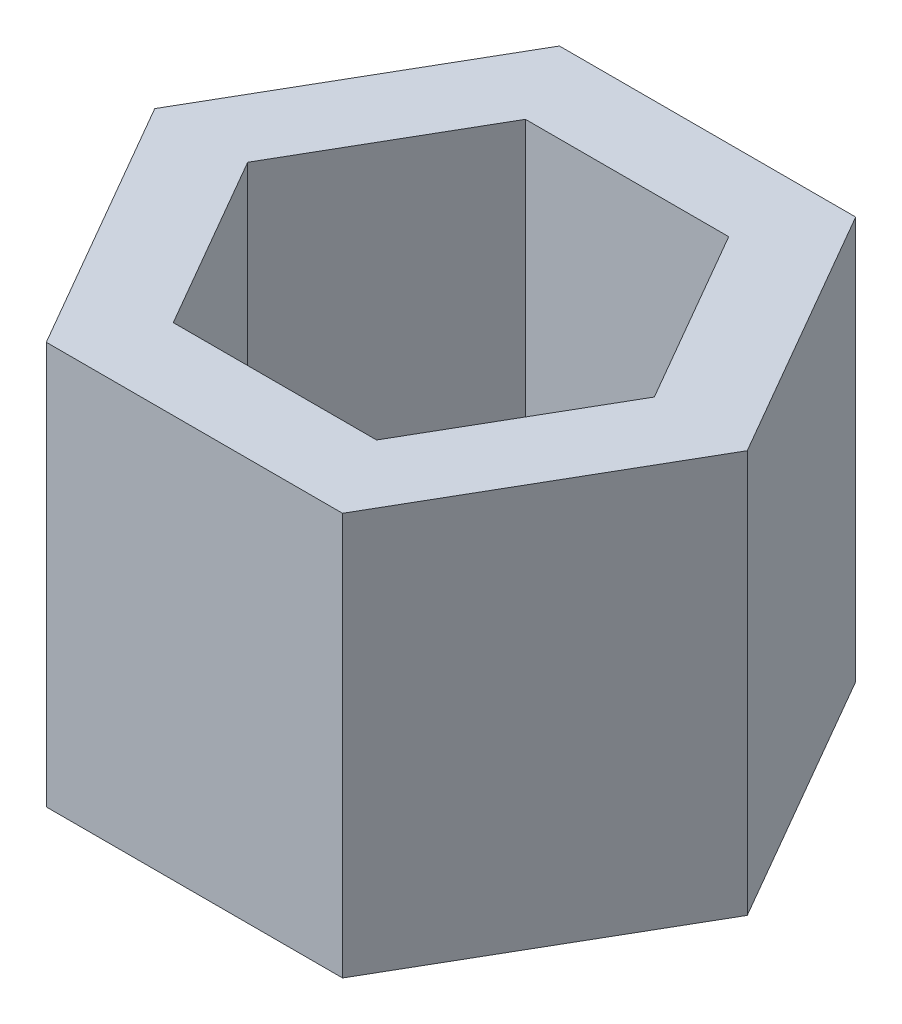
ISO-10303-21;
HEADER;
FILE_DESCRIPTION(('STEP AP214'),'2;1');
FILE_NAME('part.step','',(''),(''),'','','');
FILE_SCHEMA(('AUTOMOTIVE_DESIGN { 1 0 10303 214 1 1 1 1 }'));
ENDSEC;
DATA;
#1=APPLICATION_CONTEXT('core data for automotive mechanical design processes');
#2=APPLICATION_PROTOCOL_DEFINITION('international standard','automotive_design',2000,#1);
#3=PRODUCT_CONTEXT('',#1,'mechanical');
#4=PRODUCT('Part','Part','',(#3));
#5=PRODUCT_RELATED_PRODUCT_CATEGORY('part','',(#4));
#6=PRODUCT_DEFINITION_FORMATION('','',#4);
#7=PRODUCT_DEFINITION_CONTEXT('part definition',#1,'design');
#8=PRODUCT_DEFINITION('design','',#6,#7);
#9=PRODUCT_DEFINITION_SHAPE('','',#8);
#10=(LENGTH_UNIT() NAMED_UNIT(*) SI_UNIT(.MILLI.,.METRE.));
#11=(NAMED_UNIT(*) PLANE_ANGLE_UNIT() SI_UNIT($,.RADIAN.));
#12=(NAMED_UNIT(*) SI_UNIT($,.STERADIAN.) SOLID_ANGLE_UNIT());
#13=UNCERTAINTY_MEASURE_WITH_UNIT(LENGTH_MEASURE(1.E-05),#10,'distance_accuracy_value','');
#14=(GEOMETRIC_REPRESENTATION_CONTEXT(3) GLOBAL_UNCERTAINTY_ASSIGNED_CONTEXT((#13)) GLOBAL_UNIT_ASSIGNED_CONTEXT((#10,
#11,#12)) REPRESENTATION_CONTEXT('',''));
#15=CARTESIAN_POINT('',(0.,0.,0.));
#16=DIRECTION('',(0.,0.,1.));
#17=DIRECTION('',(1.,0.,0.));
#18=AXIS2_PLACEMENT_3D('',#15,#16,#17);
#19=CARTESIAN_POINT('',(0.,10.,0.));
#20=DIRECTION('',(0.,1.,0.));
#21=DIRECTION('',(0.,0.,1.));
#22=AXIS2_PLACEMENT_3D('',#19,#20,#21);
#23=PLANE('',#22);
#24=DIRECTION('',(0.5,0.,-0.866025403784439));
#25=VECTOR('',#24,1.);
#26=CARTESIAN_POINT('',(3.68060796608389,10.,6.37499999999998));
#27=LINE('',#26,#25);
#28=CARTESIAN_POINT('',(3.68060796608389,10.,6.37499999999998));
#29=VERTEX_POINT('',#28);
#30=CARTESIAN_POINT('',(7.36121593216773,10.,0.));
#31=VERTEX_POINT('',#30);
#32=EDGE_CURVE('E173',#29,#31,#27,.T.);
#33=ORIENTED_EDGE('',*,*,#32,.T.);
#34=DIRECTION('',(-0.5,0.,-0.866025403784439));
#35=VECTOR('',#34,1.);
#36=CARTESIAN_POINT('',(7.36121593216773,10.,0.));
#37=LINE('',#36,#35);
#38=CARTESIAN_POINT('',(3.68060796608385,10.,-6.37500000000001));
#39=VERTEX_POINT('',#38);
#40=EDGE_CURVE('E176',#31,#39,#37,.T.);
#41=ORIENTED_EDGE('',*,*,#40,.T.);
#42=DIRECTION('',(-1.,0.,0.));
#43=VECTOR('',#42,1.);
#44=CARTESIAN_POINT('',(3.68060796608385,10.,-6.37500000000001));
#45=LINE('',#44,#43);
#46=CARTESIAN_POINT('',(-3.68060796608387,10.,-6.37500000000001));
#47=VERTEX_POINT('',#46);
#48=EDGE_CURVE('E179',#39,#47,#45,.T.);
#49=ORIENTED_EDGE('',*,*,#48,.T.);
#50=DIRECTION('',(-0.5,0.,0.866025403784439));
#51=VECTOR('',#50,1.);
#52=CARTESIAN_POINT('',(-3.68060796608387,10.,-6.37500000000001));
#53=LINE('',#52,#51);
#54=CARTESIAN_POINT('',(-7.36121593216774,10.,0.));
#55=VERTEX_POINT('',#54);
#56=EDGE_CURVE('E181',#47,#55,#53,.T.);
#57=ORIENTED_EDGE('',*,*,#56,.T.);
#58=DIRECTION('',(0.5,0.,0.866025403784439));
#59=VECTOR('',#58,1.);
#60=CARTESIAN_POINT('',(-7.36121593216774,10.,0.));
#61=LINE('',#60,#59);
#62=CARTESIAN_POINT('',(-3.68060796608387,10.,6.37499999999999));
#63=VERTEX_POINT('',#62);
#64=EDGE_CURVE('E183',#55,#63,#61,.T.);
#65=ORIENTED_EDGE('',*,*,#64,.T.);
#66=DIRECTION('',(1.,0.,0.));
#67=VECTOR('',#66,1.);
#68=CARTESIAN_POINT('',(-3.68060796608387,10.,6.37499999999999));
#69=LINE('',#68,#67);
#70=EDGE_CURVE('E185',#63,#29,#69,.T.);
#71=ORIENTED_EDGE('',*,*,#70,.T.);
#72=EDGE_LOOP('',(#33,#41,#49,#57,#65,#71));
#73=FACE_BOUND('',#72,.T.);
#74=DIRECTION('',(-1.,0.,0.));
#75=VECTOR('',#74,1.);
#76=CARTESIAN_POINT('',(2.52590742770459,10.,-4.375));
#77=LINE('',#76,#75);
#78=CARTESIAN_POINT('',(2.52590742770459,10.,-4.375));
#79=VERTEX_POINT('',#78);
#80=CARTESIAN_POINT('',(-2.52590742770461,10.,-4.375));
#81=VERTEX_POINT('',#80);
#82=EDGE_CURVE('E130',#79,#81,#77,.T.);
#83=ORIENTED_EDGE('',*,*,#82,.F.);
#84=DIRECTION('',(-0.500000000000001,0.,-0.866025403784438));
#85=VECTOR('',#84,1.);
#86=CARTESIAN_POINT('',(5.05181485540919,10.,0.));
#87=LINE('',#86,#85);
#88=CARTESIAN_POINT('',(5.05181485540919,10.,0.));
#89=VERTEX_POINT('',#88);
#90=EDGE_CURVE('E122',#89,#79,#87,.T.);
#91=ORIENTED_EDGE('',*,*,#90,.F.);
#92=DIRECTION('',(0.499999999999999,0.,-0.866025403784439));
#93=VECTOR('',#92,1.);
#94=CARTESIAN_POINT('',(2.52590742770457,10.,4.375));
#95=LINE('',#94,#93);
#96=CARTESIAN_POINT('',(2.52590742770457,10.,4.375));
#97=VERTEX_POINT('',#96);
#98=EDGE_CURVE('E151',#97,#89,#95,.T.);
#99=ORIENTED_EDGE('',*,*,#98,.F.);
#100=DIRECTION('',(1.,0.,0.));
#101=VECTOR('',#100,1.);
#102=CARTESIAN_POINT('',(-2.52590742770461,10.,4.375));
#103=LINE('',#102,#101);
#104=CARTESIAN_POINT('',(-2.52590742770461,10.,4.375));
#105=VERTEX_POINT('',#104);
#106=EDGE_CURVE('E149',#105,#97,#103,.T.);
#107=ORIENTED_EDGE('',*,*,#106,.F.);
#108=DIRECTION('',(0.5,0.,0.866025403784439));
#109=VECTOR('',#108,1.);
#110=CARTESIAN_POINT('',(-5.05181485540922,10.,0.));
#111=LINE('',#110,#109);
#112=CARTESIAN_POINT('',(-5.05181485540922,10.,0.));
#113=VERTEX_POINT('',#112);
#114=EDGE_CURVE('E145',#113,#105,#111,.T.);
#115=ORIENTED_EDGE('',*,*,#114,.F.);
#116=DIRECTION('',(-0.499999999999999,0.,0.866025403784439));
#117=VECTOR('',#116,1.);
#118=CARTESIAN_POINT('',(-2.52590742770461,10.,-4.375));
#119=LINE('',#118,#117);
#120=EDGE_CURVE('E143',#81,#113,#119,.T.);
#121=ORIENTED_EDGE('',*,*,#120,.F.);
#122=EDGE_LOOP('',(#83,#91,#99,#107,#115,#121));
#123=FACE_BOUND('',#122,.T.);
#124=ADVANCED_FACE('F33',(#73,#123),#23,.T.);
#125=CARTESIAN_POINT('',(0.,0.,0.));
#126=DIRECTION('',(0.,1.,0.));
#127=DIRECTION('',(0.,0.,1.));
#128=AXIS2_PLACEMENT_3D('',#125,#126,#127);
#129=PLANE('',#128);
#130=DIRECTION('',(0.5,0.,-0.866025403784439));
#131=VECTOR('',#130,1.);
#132=CARTESIAN_POINT('',(3.68060796608389,0.,6.37499999999998));
#133=LINE('',#132,#131);
#134=CARTESIAN_POINT('',(3.68060796608389,0.,6.37499999999998));
#135=VERTEX_POINT('',#134);
#136=CARTESIAN_POINT('',(7.36121593216773,0.,0.));
#137=VERTEX_POINT('',#136);
#138=EDGE_CURVE('E138',#135,#137,#133,.T.);
#139=ORIENTED_EDGE('',*,*,#138,.F.);
#140=DIRECTION('',(1.,0.,0.));
#141=VECTOR('',#140,1.);
#142=CARTESIAN_POINT('',(-3.68060796608387,0.,6.37499999999999));
#143=LINE('',#142,#141);
#144=CARTESIAN_POINT('',(-3.68060796608387,0.,6.37499999999999));
#145=VERTEX_POINT('',#144);
#146=EDGE_CURVE('E177',#145,#135,#143,.T.);
#147=ORIENTED_EDGE('',*,*,#146,.F.);
#148=DIRECTION('',(0.5,0.,0.866025403784439));
#149=VECTOR('',#148,1.);
#150=CARTESIAN_POINT('',(-7.36121593216774,0.,0.));
#151=LINE('',#150,#149);
#152=CARTESIAN_POINT('',(-7.36121593216774,0.,0.));
#153=VERTEX_POINT('',#152);
#154=EDGE_CURVE('E196',#153,#145,#151,.T.);
#155=ORIENTED_EDGE('',*,*,#154,.F.);
#156=DIRECTION('',(-0.5,0.,0.866025403784439));
#157=VECTOR('',#156,1.);
#158=CARTESIAN_POINT('',(-3.68060796608387,0.,-6.37500000000001));
#159=LINE('',#158,#157);
#160=CARTESIAN_POINT('',(-3.68060796608387,0.,-6.37500000000001));
#161=VERTEX_POINT('',#160);
#162=EDGE_CURVE('E194',#161,#153,#159,.T.);
#163=ORIENTED_EDGE('',*,*,#162,.F.);
#164=DIRECTION('',(-1.,0.,0.));
#165=VECTOR('',#164,1.);
#166=CARTESIAN_POINT('',(3.68060796608385,0.,-6.37500000000001));
#167=LINE('',#166,#165);
#168=CARTESIAN_POINT('',(3.68060796608385,0.,-6.37500000000001));
#169=VERTEX_POINT('',#168);
#170=EDGE_CURVE('E192',#169,#161,#167,.T.);
#171=ORIENTED_EDGE('',*,*,#170,.F.);
#172=DIRECTION('',(-0.5,0.,-0.866025403784439));
#173=VECTOR('',#172,1.);
#174=CARTESIAN_POINT('',(7.36121593216773,0.,0.));
#175=LINE('',#174,#173);
#176=EDGE_CURVE('E190',#137,#169,#175,.T.);
#177=ORIENTED_EDGE('',*,*,#176,.F.);
#178=EDGE_LOOP('',(#139,#147,#155,#163,#171,#177));
#179=FACE_BOUND('',#178,.T.);
#180=DIRECTION('',(-0.500000000000001,0.,-0.866025403784438));
#181=VECTOR('',#180,1.);
#182=CARTESIAN_POINT('',(5.05181485540919,0.,0.));
#183=LINE('',#182,#181);
#184=CARTESIAN_POINT('',(5.05181485540919,0.,0.));
#185=VERTEX_POINT('',#184);
#186=CARTESIAN_POINT('',(2.52590742770459,0.,-4.375));
#187=VERTEX_POINT('',#186);
#188=EDGE_CURVE('E56',#185,#187,#183,.T.);
#189=ORIENTED_EDGE('',*,*,#188,.T.);
#190=DIRECTION('',(-1.,0.,0.));
#191=VECTOR('',#190,1.);
#192=CARTESIAN_POINT('',(2.52590742770459,0.,-4.375));
#193=LINE('',#192,#191);
#194=CARTESIAN_POINT('',(-2.52590742770461,0.,-4.375));
#195=VERTEX_POINT('',#194);
#196=EDGE_CURVE('E137',#187,#195,#193,.T.);
#197=ORIENTED_EDGE('',*,*,#196,.T.);
#198=DIRECTION('',(-0.499999999999999,0.,0.866025403784439));
#199=VECTOR('',#198,1.);
#200=CARTESIAN_POINT('',(-2.52590742770461,0.,-4.375));
#201=LINE('',#200,#199);
#202=CARTESIAN_POINT('',(-5.05181485540922,0.,0.));
#203=VERTEX_POINT('',#202);
#204=EDGE_CURVE('E155',#195,#203,#201,.T.);
#205=ORIENTED_EDGE('',*,*,#204,.T.);
#206=DIRECTION('',(0.5,0.,0.866025403784439));
#207=VECTOR('',#206,1.);
#208=CARTESIAN_POINT('',(-5.05181485540922,0.,0.));
#209=LINE('',#208,#207);
#210=CARTESIAN_POINT('',(-2.52590742770461,0.,4.375));
#211=VERTEX_POINT('',#210);
#212=EDGE_CURVE('E158',#203,#211,#209,.T.);
#213=ORIENTED_EDGE('',*,*,#212,.T.);
#214=DIRECTION('',(1.,0.,0.));
#215=VECTOR('',#214,1.);
#216=CARTESIAN_POINT('',(-2.52590742770461,0.,4.375));
#217=LINE('',#216,#215);
#218=CARTESIAN_POINT('',(2.52590742770457,0.,4.375));
#219=VERTEX_POINT('',#218);
#220=EDGE_CURVE('E161',#211,#219,#217,.T.);
#221=ORIENTED_EDGE('',*,*,#220,.T.);
#222=DIRECTION('',(0.499999999999999,0.,-0.866025403784439));
#223=VECTOR('',#222,1.);
#224=CARTESIAN_POINT('',(2.52590742770457,0.,4.375));
#225=LINE('',#224,#223);
#226=EDGE_CURVE('E131',#219,#185,#225,.T.);
#227=ORIENTED_EDGE('',*,*,#226,.T.);
#228=EDGE_LOOP('',(#189,#197,#205,#213,#221,#227));
#229=FACE_BOUND('',#228,.T.);
#230=ADVANCED_FACE('F220',(#179,#229),#129,.F.);
#231=CARTESIAN_POINT('',(3.68060796608389,10.,6.37499999999998));
#232=DIRECTION('',(-0.866025403784439,0.,-0.5));
#233=DIRECTION('',(-0.5,0.,0.866025403784439));
#234=AXIS2_PLACEMENT_3D('',#231,#232,#233);
#235=PLANE('',#234);
#236=ORIENTED_EDGE('',*,*,#138,.T.);
#237=DIRECTION('',(0.,-1.,0.));
#238=VECTOR('',#237,1.);
#239=CARTESIAN_POINT('',(7.36121593216773,10.,0.));
#240=LINE('',#239,#238);
#241=EDGE_CURVE('E11',#31,#137,#240,.T.);
#242=ORIENTED_EDGE('',*,*,#241,.F.);
#243=ORIENTED_EDGE('',*,*,#32,.F.);
#244=DIRECTION('',(0.,-1.,0.));
#245=VECTOR('',#244,1.);
#246=CARTESIAN_POINT('',(3.68060796608389,10.,6.37499999999998));
#247=LINE('',#246,#245);
#248=EDGE_CURVE('E187',#29,#135,#247,.T.);
#249=ORIENTED_EDGE('',*,*,#248,.T.);
#250=EDGE_LOOP('',(#236,#242,#243,#249));
#251=FACE_BOUND('',#250,.T.);
#252=ADVANCED_FACE('F35',(#251),#235,.F.);
#253=CARTESIAN_POINT('',(7.36121593216773,10.,0.));
#254=DIRECTION('',(-0.866025403784439,0.,0.5));
#255=DIRECTION('',(0.5,0.,0.866025403784439));
#256=AXIS2_PLACEMENT_3D('',#253,#254,#255);
#257=PLANE('',#256);
#258=ORIENTED_EDGE('',*,*,#176,.T.);
#259=DIRECTION('',(0.,-1.,0.));
#260=VECTOR('',#259,1.);
#261=CARTESIAN_POINT('',(3.68060796608385,10.,-6.37500000000001));
#262=LINE('',#261,#260);
#263=EDGE_CURVE('E41',#39,#169,#262,.T.);
#264=ORIENTED_EDGE('',*,*,#263,.F.);
#265=ORIENTED_EDGE('',*,*,#40,.F.);
#266=ORIENTED_EDGE('',*,*,#241,.T.);
#267=EDGE_LOOP('',(#258,#264,#265,#266));
#268=FACE_BOUND('',#267,.T.);
#269=ADVANCED_FACE('F237',(#268),#257,.F.);
#270=CARTESIAN_POINT('',(3.68060796608385,10.,-6.37500000000001));
#271=DIRECTION('',(0.,0.,1.));
#272=DIRECTION('',(1.,0.,0.));
#273=AXIS2_PLACEMENT_3D('',#270,#271,#272);
#274=PLANE('',#273);
#275=ORIENTED_EDGE('',*,*,#170,.T.);
#276=DIRECTION('',(0.,-1.,0.));
#277=VECTOR('',#276,1.);
#278=CARTESIAN_POINT('',(-3.68060796608387,10.,-6.37500000000001));
#279=LINE('',#278,#277);
#280=EDGE_CURVE('E207',#47,#161,#279,.T.);
#281=ORIENTED_EDGE('',*,*,#280,.F.);
#282=ORIENTED_EDGE('',*,*,#48,.F.);
#283=ORIENTED_EDGE('',*,*,#263,.T.);
#284=EDGE_LOOP('',(#275,#281,#282,#283));
#285=FACE_BOUND('',#284,.T.);
#286=ADVANCED_FACE('F214',(#285),#274,.F.);
#287=CARTESIAN_POINT('',(-3.68060796608387,10.,-6.37500000000001));
#288=DIRECTION('',(0.866025403784439,0.,0.5));
#289=DIRECTION('',(0.5,0.,-0.866025403784439));
#290=AXIS2_PLACEMENT_3D('',#287,#288,#289);
#291=PLANE('',#290);
#292=ORIENTED_EDGE('',*,*,#162,.T.);
#293=DIRECTION('',(0.,-1.,0.));
#294=VECTOR('',#293,1.);
#295=CARTESIAN_POINT('',(-7.36121593216774,10.,0.));
#296=LINE('',#295,#294);
#297=EDGE_CURVE('E204',#55,#153,#296,.T.);
#298=ORIENTED_EDGE('',*,*,#297,.F.);
#299=ORIENTED_EDGE('',*,*,#56,.F.);
#300=ORIENTED_EDGE('',*,*,#280,.T.);
#301=EDGE_LOOP('',(#292,#298,#299,#300));
#302=FACE_BOUND('',#301,.T.);
#303=ADVANCED_FACE('F226',(#302),#291,.F.);
#304=CARTESIAN_POINT('',(-7.36121593216774,10.,0.));
#305=DIRECTION('',(0.866025403784439,0.,-0.5));
#306=DIRECTION('',(-0.5,0.,-0.866025403784439));
#307=AXIS2_PLACEMENT_3D('',#304,#305,#306);
#308=PLANE('',#307);
#309=ORIENTED_EDGE('',*,*,#154,.T.);
#310=DIRECTION('',(0.,-1.,0.));
#311=VECTOR('',#310,1.);
#312=CARTESIAN_POINT('',(-3.68060796608387,10.,6.37499999999999));
#313=LINE('',#312,#311);
#314=EDGE_CURVE('E201',#63,#145,#313,.T.);
#315=ORIENTED_EDGE('',*,*,#314,.F.);
#316=ORIENTED_EDGE('',*,*,#64,.F.);
#317=ORIENTED_EDGE('',*,*,#297,.T.);
#318=EDGE_LOOP('',(#309,#315,#316,#317));
#319=FACE_BOUND('',#318,.T.);
#320=ADVANCED_FACE('F230',(#319),#308,.F.);
#321=CARTESIAN_POINT('',(-3.68060796608387,10.,6.37499999999999));
#322=DIRECTION('',(0.,0.,-1.));
#323=DIRECTION('',(-1.,0.,0.));
#324=AXIS2_PLACEMENT_3D('',#321,#322,#323);
#325=PLANE('',#324);
#326=ORIENTED_EDGE('',*,*,#146,.T.);
#327=ORIENTED_EDGE('',*,*,#248,.F.);
#328=ORIENTED_EDGE('',*,*,#70,.F.);
#329=ORIENTED_EDGE('',*,*,#314,.T.);
#330=EDGE_LOOP('',(#326,#327,#328,#329));
#331=FACE_BOUND('',#330,.T.);
#332=ADVANCED_FACE('F240',(#331),#325,.F.);
#333=CARTESIAN_POINT('',(5.05181485540919,10.,0.));
#334=DIRECTION('',(-0.866025403784438,0.,0.500000000000001));
#335=DIRECTION('',(0.500000000000001,0.,0.866025403784438));
#336=AXIS2_PLACEMENT_3D('',#333,#334,#335);
#337=PLANE('',#336);
#338=ORIENTED_EDGE('',*,*,#188,.F.);
#339=DIRECTION('',(0.,-1.,0.));
#340=VECTOR('',#339,1.);
#341=CARTESIAN_POINT('',(5.05181485540919,10.,0.));
#342=LINE('',#341,#340);
#343=EDGE_CURVE('E126',#89,#185,#342,.T.);
#344=ORIENTED_EDGE('',*,*,#343,.F.);
#345=ORIENTED_EDGE('',*,*,#90,.T.);
#346=DIRECTION('',(0.,-1.,0.));
#347=VECTOR('',#346,1.);
#348=CARTESIAN_POINT('',(2.52590742770459,10.,-4.375));
#349=LINE('',#348,#347);
#350=EDGE_CURVE('E125',#79,#187,#349,.T.);
#351=ORIENTED_EDGE('',*,*,#350,.T.);
#352=EDGE_LOOP('',(#338,#344,#345,#351));
#353=FACE_BOUND('',#352,.T.);
#354=ADVANCED_FACE('F124',(#353),#337,.T.);
#355=CARTESIAN_POINT('',(2.52590742770459,10.,-4.375));
#356=DIRECTION('',(0.,0.,1.));
#357=DIRECTION('',(1.,0.,0.));
#358=AXIS2_PLACEMENT_3D('',#355,#356,#357);
#359=PLANE('',#358);
#360=ORIENTED_EDGE('',*,*,#196,.F.);
#361=ORIENTED_EDGE('',*,*,#350,.F.);
#362=ORIENTED_EDGE('',*,*,#82,.T.);
#363=DIRECTION('',(0.,-1.,0.));
#364=VECTOR('',#363,1.);
#365=CARTESIAN_POINT('',(-2.52590742770461,10.,-4.375));
#366=LINE('',#365,#364);
#367=EDGE_CURVE('E139',#81,#195,#366,.T.);
#368=ORIENTED_EDGE('',*,*,#367,.T.);
#369=EDGE_LOOP('',(#360,#361,#362,#368));
#370=FACE_BOUND('',#369,.T.);
#371=ADVANCED_FACE('F134',(#370),#359,.T.);
#372=CARTESIAN_POINT('',(-2.52590742770461,10.,-4.375));
#373=DIRECTION('',(0.866025403784439,0.,0.5));
#374=DIRECTION('',(0.5,0.,-0.866025403784439));
#375=AXIS2_PLACEMENT_3D('',#372,#373,#374);
#376=PLANE('',#375);
#377=ORIENTED_EDGE('',*,*,#204,.F.);
#378=ORIENTED_EDGE('',*,*,#367,.F.);
#379=ORIENTED_EDGE('',*,*,#120,.T.);
#380=DIRECTION('',(0.,-1.,0.));
#381=VECTOR('',#380,1.);
#382=CARTESIAN_POINT('',(-5.05181485540922,10.,0.));
#383=LINE('',#382,#381);
#384=EDGE_CURVE('E170',#113,#203,#383,.T.);
#385=ORIENTED_EDGE('',*,*,#384,.T.);
#386=EDGE_LOOP('',(#377,#378,#379,#385));
#387=FACE_BOUND('',#386,.T.);
#388=ADVANCED_FACE('F258',(#387),#376,.T.);
#389=CARTESIAN_POINT('',(-5.05181485540922,10.,0.));
#390=DIRECTION('',(0.866025403784439,0.,-0.5));
#391=DIRECTION('',(-0.5,0.,-0.866025403784439));
#392=AXIS2_PLACEMENT_3D('',#389,#390,#391);
#393=PLANE('',#392);
#394=ORIENTED_EDGE('',*,*,#212,.F.);
#395=ORIENTED_EDGE('',*,*,#384,.F.);
#396=ORIENTED_EDGE('',*,*,#114,.T.);
#397=DIRECTION('',(0.,-1.,0.));
#398=VECTOR('',#397,1.);
#399=CARTESIAN_POINT('',(-2.52590742770461,10.,4.375));
#400=LINE('',#399,#398);
#401=EDGE_CURVE('E168',#105,#211,#400,.T.);
#402=ORIENTED_EDGE('',*,*,#401,.T.);
#403=EDGE_LOOP('',(#394,#395,#396,#402));
#404=FACE_BOUND('',#403,.T.);
#405=ADVANCED_FACE('F261',(#404),#393,.T.);
#406=CARTESIAN_POINT('',(-2.52590742770461,10.,4.375));
#407=DIRECTION('',(0.,0.,-1.));
#408=DIRECTION('',(-1.,0.,0.));
#409=AXIS2_PLACEMENT_3D('',#406,#407,#408);
#410=PLANE('',#409);
#411=ORIENTED_EDGE('',*,*,#220,.F.);
#412=ORIENTED_EDGE('',*,*,#401,.F.);
#413=ORIENTED_EDGE('',*,*,#106,.T.);
#414=DIRECTION('',(0.,-1.,0.));
#415=VECTOR('',#414,1.);
#416=CARTESIAN_POINT('',(2.52590742770457,10.,4.375));
#417=LINE('',#416,#415);
#418=EDGE_CURVE('E48',#97,#219,#417,.T.);
#419=ORIENTED_EDGE('',*,*,#418,.T.);
#420=EDGE_LOOP('',(#411,#412,#413,#419));
#421=FACE_BOUND('',#420,.T.);
#422=ADVANCED_FACE('F265',(#421),#410,.T.);
#423=CARTESIAN_POINT('',(2.52590742770457,10.,4.375));
#424=DIRECTION('',(-0.866025403784439,0.,-0.499999999999999));
#425=DIRECTION('',(-0.499999999999999,0.,0.866025403784439));
#426=AXIS2_PLACEMENT_3D('',#423,#424,#425);
#427=PLANE('',#426);
#428=ORIENTED_EDGE('',*,*,#226,.F.);
#429=ORIENTED_EDGE('',*,*,#418,.F.);
#430=ORIENTED_EDGE('',*,*,#98,.T.);
#431=ORIENTED_EDGE('',*,*,#343,.T.);
#432=EDGE_LOOP('',(#428,#429,#430,#431));
#433=FACE_BOUND('',#432,.T.);
#434=ADVANCED_FACE('F269',(#433),#427,.T.);
#435=CLOSED_SHELL('',(#124,#230,#252,#269,#286,#303,#320,#332,#354,#371,#388,#405,#422,#434));
#436=MANIFOLD_SOLID_BREP('B2',#435);
#437=ADVANCED_BREP_SHAPE_REPRESENTATION('',(#18,#436),#14);
#438=SHAPE_DEFINITION_REPRESENTATION(#9,#437);
ENDSEC;
END-ISO-10303-21;
